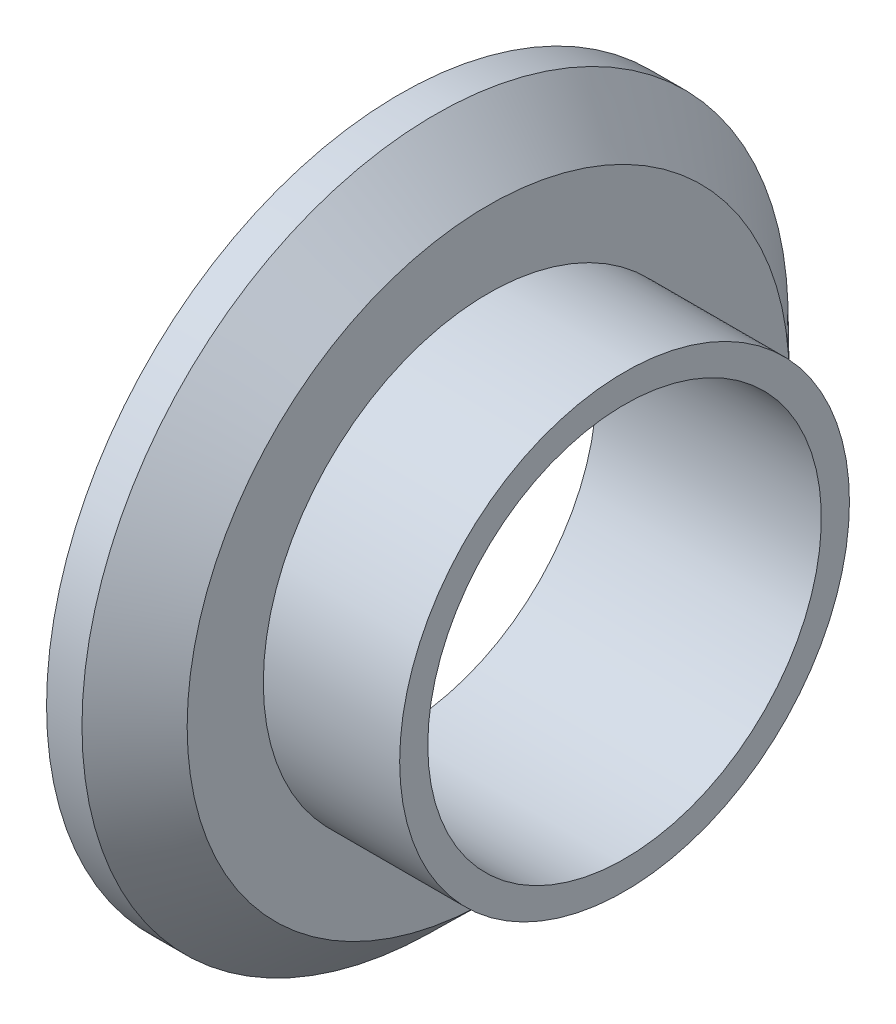
ISO-10303-21;
HEADER;
FILE_DESCRIPTION(('STEP AP214'),'2;1');
FILE_NAME('part.step','',(''),(''),'','','');
FILE_SCHEMA(('AUTOMOTIVE_DESIGN { 1 0 10303 214 1 1 1 1 }'));
ENDSEC;
DATA;
#1=APPLICATION_CONTEXT('core data for automotive mechanical design processes');
#2=APPLICATION_PROTOCOL_DEFINITION('international standard','automotive_design',2000,#1);
#3=PRODUCT_CONTEXT('',#1,'mechanical');
#4=PRODUCT('Part','Part','',(#3));
#5=PRODUCT_RELATED_PRODUCT_CATEGORY('part','',(#4));
#6=PRODUCT_DEFINITION_FORMATION('','',#4);
#7=PRODUCT_DEFINITION_CONTEXT('part definition',#1,'design');
#8=PRODUCT_DEFINITION('design','',#6,#7);
#9=PRODUCT_DEFINITION_SHAPE('','',#8);
#10=(LENGTH_UNIT() NAMED_UNIT(*) SI_UNIT(.MILLI.,.METRE.));
#11=(NAMED_UNIT(*) PLANE_ANGLE_UNIT() SI_UNIT($,.RADIAN.));
#12=(NAMED_UNIT(*) SI_UNIT($,.STERADIAN.) SOLID_ANGLE_UNIT());
#13=UNCERTAINTY_MEASURE_WITH_UNIT(LENGTH_MEASURE(1.E-05),#10,'distance_accuracy_value','');
#14=(GEOMETRIC_REPRESENTATION_CONTEXT(3) GLOBAL_UNCERTAINTY_ASSIGNED_CONTEXT((#13)) GLOBAL_UNIT_ASSIGNED_CONTEXT((#10,
#11,#12)) REPRESENTATION_CONTEXT('',''));
#15=CARTESIAN_POINT('',(0.,0.,0.));
#16=DIRECTION('',(0.,0.,1.));
#17=DIRECTION('',(1.,0.,0.));
#18=AXIS2_PLACEMENT_3D('',#15,#16,#17);
#19=CARTESIAN_POINT('',(1.,19.94,0.));
#20=DIRECTION('',(1.,0.,0.));
#21=DIRECTION('',(0.,0.,-1.));
#22=AXIS2_PLACEMENT_3D('',#19,#20,#21);
#23=PLANE('',#22);
#24=CARTESIAN_POINT('',(1.,0.,0.));
#25=DIRECTION('',(-1.,0.,0.));
#26=DIRECTION('',(0.,0.,1.));
#27=AXIS2_PLACEMENT_3D('',#24,#25,#26);
#28=CIRCLE('',#27,11.1125);
#29=CARTESIAN_POINT('',(1.,0.,11.1125));
#30=VERTEX_POINT('',#29);
#31=EDGE_CURVE('E10',#30,#30,#28,.T.);
#32=ORIENTED_EDGE('',*,*,#31,.F.);
#33=EDGE_LOOP('',(#32));
#34=FACE_BOUND('',#33,.T.);
#35=CARTESIAN_POINT('',(1.,0.,0.));
#36=DIRECTION('',(-1.,0.,0.));
#37=DIRECTION('',(0.,0.,1.));
#38=AXIS2_PLACEMENT_3D('',#35,#36,#37);
#39=CIRCLE('',#38,19.94);
#40=CARTESIAN_POINT('',(1.,0.,19.94));
#41=VERTEX_POINT('',#40);
#42=EDGE_CURVE('E68',#41,#41,#39,.T.);
#43=ORIENTED_EDGE('',*,*,#42,.T.);
#44=EDGE_LOOP('',(#43));
#45=FACE_BOUND('',#44,.T.);
#46=ADVANCED_FACE('F37',(#34,#45),#23,.F.);
#47=CARTESIAN_POINT('',(-110.,0.,0.));
#48=DIRECTION('',(-1.,0.,0.));
#49=DIRECTION('',(0.,0.,1.));
#50=AXIS2_PLACEMENT_3D('',#47,#48,#49);
#51=CYLINDRICAL_SURFACE('',#50,11.1125);
#52=CARTESIAN_POINT('',(13.7,0.,0.));
#53=DIRECTION('',(-1.,0.,0.));
#54=DIRECTION('',(0.,0.,1.));
#55=AXIS2_PLACEMENT_3D('',#52,#53,#54);
#56=CIRCLE('',#55,11.1125);
#57=CARTESIAN_POINT('',(13.7,0.,11.1125));
#58=VERTEX_POINT('',#57);
#59=EDGE_CURVE('E44',#58,#58,#56,.T.);
#60=ORIENTED_EDGE('',*,*,#59,.F.);
#61=EDGE_LOOP('',(#60));
#62=FACE_BOUND('',#61,.T.);
#63=ORIENTED_EDGE('',*,*,#31,.T.);
#64=EDGE_LOOP('',(#63));
#65=FACE_BOUND('',#64,.T.);
#66=ADVANCED_FACE('F100',(#62,#65),#51,.F.);
#67=CARTESIAN_POINT('',(13.7,11.1125,0.));
#68=DIRECTION('',(-1.,0.,0.));
#69=DIRECTION('',(0.,0.,1.));
#70=AXIS2_PLACEMENT_3D('',#67,#68,#69);
#71=PLANE('',#70);
#72=CARTESIAN_POINT('',(13.7,0.,0.));
#73=DIRECTION('',(-1.,0.,0.));
#74=DIRECTION('',(0.,0.,1.));
#75=AXIS2_PLACEMENT_3D('',#72,#73,#74);
#76=CIRCLE('',#75,12.7);
#77=CARTESIAN_POINT('',(13.7,0.,12.7));
#78=VERTEX_POINT('',#77);
#79=EDGE_CURVE('E49',#78,#78,#76,.T.);
#80=ORIENTED_EDGE('',*,*,#79,.F.);
#81=EDGE_LOOP('',(#80));
#82=FACE_BOUND('',#81,.T.);
#83=ORIENTED_EDGE('',*,*,#59,.T.);
#84=EDGE_LOOP('',(#83));
#85=FACE_BOUND('',#84,.T.);
#86=ADVANCED_FACE('F95',(#82,#85),#71,.F.);
#87=CARTESIAN_POINT('',(-110.,0.,0.));
#88=DIRECTION('',(-1.,0.,0.));
#89=DIRECTION('',(0.,0.,1.));
#90=AXIS2_PLACEMENT_3D('',#87,#88,#89);
#91=CYLINDRICAL_SURFACE('',#90,12.7);
#92=CARTESIAN_POINT('',(6.00000000000001,0.,0.));
#93=DIRECTION('',(-1.,0.,0.));
#94=DIRECTION('',(0.,0.,1.));
#95=AXIS2_PLACEMENT_3D('',#92,#93,#94);
#96=CIRCLE('',#95,12.7);
#97=CARTESIAN_POINT('',(6.00000000000001,0.,12.7));
#98=VERTEX_POINT('',#97);
#99=EDGE_CURVE('E54',#98,#98,#96,.T.);
#100=ORIENTED_EDGE('',*,*,#99,.F.);
#101=EDGE_LOOP('',(#100));
#102=FACE_BOUND('',#101,.T.);
#103=ORIENTED_EDGE('',*,*,#79,.T.);
#104=EDGE_LOOP('',(#103));
#105=FACE_BOUND('',#104,.T.);
#106=ADVANCED_FACE('F89',(#102,#105),#91,.T.);
#107=CARTESIAN_POINT('',(6.,12.7,0.));
#108=DIRECTION('',(-1.,0.,0.));
#109=DIRECTION('',(0.,0.,1.));
#110=AXIS2_PLACEMENT_3D('',#107,#108,#109);
#111=PLANE('',#110);
#112=CARTESIAN_POINT('',(6.00000000000001,0.,0.));
#113=DIRECTION('',(-1.,0.,0.));
#114=DIRECTION('',(0.,0.,1.));
#115=AXIS2_PLACEMENT_3D('',#112,#113,#114);
#116=CIRCLE('',#115,17.);
#117=CARTESIAN_POINT('',(6.00000000000001,0.,17.));
#118=VERTEX_POINT('',#117);
#119=EDGE_CURVE('E60',#118,#118,#116,.T.);
#120=ORIENTED_EDGE('',*,*,#119,.F.);
#121=EDGE_LOOP('',(#120));
#122=FACE_BOUND('',#121,.T.);
#123=ORIENTED_EDGE('',*,*,#99,.T.);
#124=EDGE_LOOP('',(#123));
#125=FACE_BOUND('',#124,.T.);
#126=ADVANCED_FACE('F83',(#122,#125),#111,.F.);
#127=CARTESIAN_POINT('',(6.00000000000001,0.,0.));
#128=DIRECTION('',(-1.,0.,0.));
#129=DIRECTION('',(0.,0.,1.));
#130=AXIS2_PLACEMENT_3D('',#127,#128,#129);
#131=CONICAL_SURFACE('',#130,17.,0.775297496812126);
#132=CARTESIAN_POINT('',(3.,0.,0.));
#133=DIRECTION('',(-1.,0.,0.));
#134=DIRECTION('',(0.,0.,1.));
#135=AXIS2_PLACEMENT_3D('',#132,#133,#134);
#136=CIRCLE('',#135,19.94);
#137=CARTESIAN_POINT('',(3.,0.,19.94));
#138=VERTEX_POINT('',#137);
#139=EDGE_CURVE('E64',#138,#138,#136,.T.);
#140=ORIENTED_EDGE('',*,*,#139,.F.);
#141=EDGE_LOOP('',(#140));
#142=FACE_BOUND('',#141,.T.);
#143=ORIENTED_EDGE('',*,*,#119,.T.);
#144=EDGE_LOOP('',(#143));
#145=FACE_BOUND('',#144,.T.);
#146=ADVANCED_FACE('F77',(#142,#145),#131,.T.);
#147=CARTESIAN_POINT('',(-110.,0.,0.));
#148=DIRECTION('',(-1.,0.,0.));
#149=DIRECTION('',(0.,0.,1.));
#150=AXIS2_PLACEMENT_3D('',#147,#148,#149);
#151=CYLINDRICAL_SURFACE('',#150,19.94);
#152=ORIENTED_EDGE('',*,*,#42,.F.);
#153=EDGE_LOOP('',(#152));
#154=FACE_BOUND('',#153,.T.);
#155=ORIENTED_EDGE('',*,*,#139,.T.);
#156=EDGE_LOOP('',(#155));
#157=FACE_BOUND('',#156,.T.);
#158=ADVANCED_FACE('F74',(#154,#157),#151,.T.);
#159=CLOSED_SHELL('',(#46,#66,#86,#106,#126,#146,#158));
#160=MANIFOLD_SOLID_BREP('B2',#159);
#161=ADVANCED_BREP_SHAPE_REPRESENTATION('',(#18,#160),#14);
#162=SHAPE_DEFINITION_REPRESENTATION(#9,#161);
ENDSEC;
END-ISO-10303-21;
